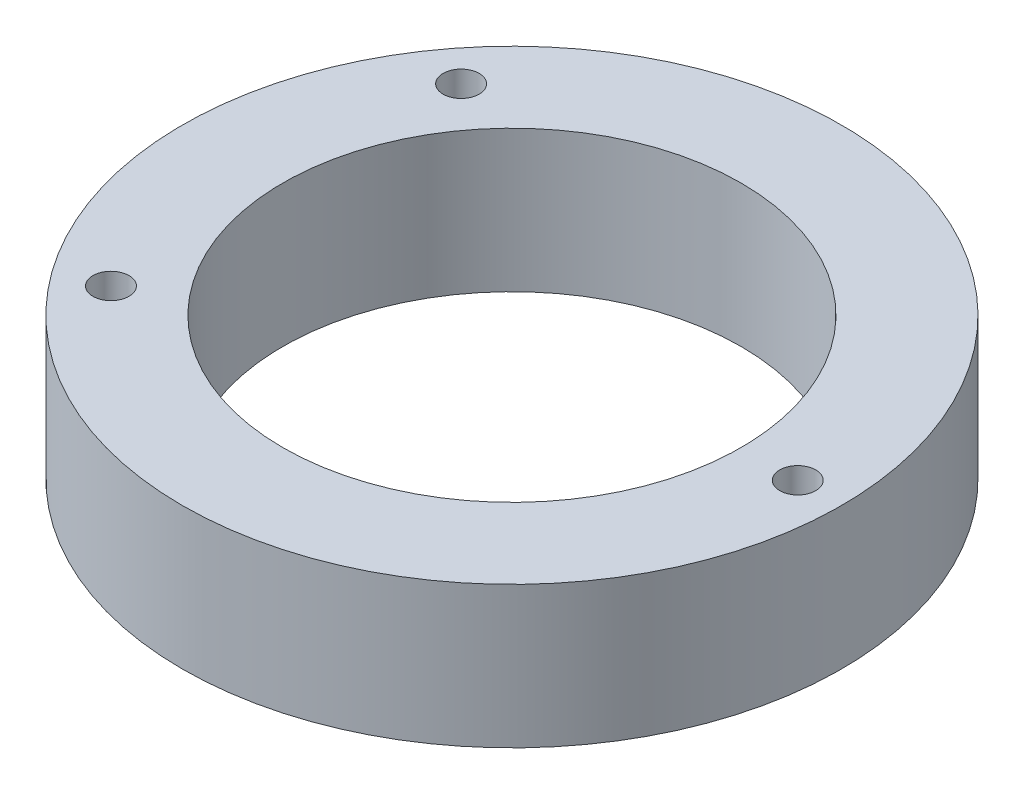
ISO-10303-21;
HEADER;
FILE_DESCRIPTION(('STEP AP214'),'2;1');
FILE_NAME('part.step','',(''),(''),'','','');
FILE_SCHEMA(('AUTOMOTIVE_DESIGN { 1 0 10303 214 1 1 1 1 }'));
ENDSEC;
DATA;
#1=APPLICATION_CONTEXT('core data for automotive mechanical design processes');
#2=APPLICATION_PROTOCOL_DEFINITION('international standard','automotive_design',2000,#1);
#3=PRODUCT_CONTEXT('',#1,'mechanical');
#4=PRODUCT('Part','Part','',(#3));
#5=PRODUCT_RELATED_PRODUCT_CATEGORY('part','',(#4));
#6=PRODUCT_DEFINITION_FORMATION('','',#4);
#7=PRODUCT_DEFINITION_CONTEXT('part definition',#1,'design');
#8=PRODUCT_DEFINITION('design','',#6,#7);
#9=PRODUCT_DEFINITION_SHAPE('','',#8);
#10=(LENGTH_UNIT() NAMED_UNIT(*) SI_UNIT(.MILLI.,.METRE.));
#11=(NAMED_UNIT(*) PLANE_ANGLE_UNIT() SI_UNIT($,.RADIAN.));
#12=(NAMED_UNIT(*) SI_UNIT($,.STERADIAN.) SOLID_ANGLE_UNIT());
#13=UNCERTAINTY_MEASURE_WITH_UNIT(LENGTH_MEASURE(1.E-05),#10,'distance_accuracy_value','');
#14=(GEOMETRIC_REPRESENTATION_CONTEXT(3) GLOBAL_UNCERTAINTY_ASSIGNED_CONTEXT((#13)) GLOBAL_UNIT_ASSIGNED_CONTEXT((#10,
#11,#12)) REPRESENTATION_CONTEXT('',''));
#15=CARTESIAN_POINT('',(0.,0.,0.));
#16=DIRECTION('',(0.,0.,1.));
#17=DIRECTION('',(1.,0.,0.));
#18=AXIS2_PLACEMENT_3D('',#15,#16,#17);
#19=CARTESIAN_POINT('',(0.,13.75,0.));
#20=DIRECTION('',(0.,1.,0.));
#21=DIRECTION('',(0.,0.,1.));
#22=AXIS2_PLACEMENT_3D('',#19,#20,#21);
#23=PLANE('',#22);
#24=CARTESIAN_POINT('',(-21.9327372290304,13.75,17.0005158051838));
#25=DIRECTION('',(0.,1.,0.));
#26=DIRECTION('',(0.,0.,1.));
#27=AXIS2_PLACEMENT_3D('',#24,#25,#26);
#28=CIRCLE('',#27,1.75);
#29=CARTESIAN_POINT('',(-21.9327372290304,13.75,18.7505158051838));
#30=VERTEX_POINT('',#29);
#31=EDGE_CURVE('E52',#30,#30,#28,.T.);
#32=ORIENTED_EDGE('',*,*,#31,.F.);
#33=EDGE_LOOP('',(#32));
#34=FACE_BOUND('',#33,.T.);
#35=CARTESIAN_POINT('',(0.,13.75,0.));
#36=DIRECTION('',(0.,1.,0.));
#37=DIRECTION('',(0.,0.,1.));
#38=AXIS2_PLACEMENT_3D('',#35,#36,#37);
#39=CIRCLE('',#38,22.2499999999997);
#40=CARTESIAN_POINT('',(0.,13.75,22.2499999999997));
#41=VERTEX_POINT('',#40);
#42=EDGE_CURVE('E41',#41,#41,#39,.T.);
#43=ORIENTED_EDGE('',*,*,#42,.F.);
#44=EDGE_LOOP('',(#43));
#45=FACE_BOUND('',#44,.T.);
#46=CARTESIAN_POINT('',(0.,13.75,0.));
#47=DIRECTION('',(0.,1.,0.));
#48=DIRECTION('',(0.,0.,1.));
#49=AXIS2_PLACEMENT_3D('',#46,#47,#48);
#50=CIRCLE('',#49,32.);
#51=CARTESIAN_POINT('',(0.,13.75,32.));
#52=VERTEX_POINT('',#51);
#53=EDGE_CURVE('E10',#52,#52,#50,.T.);
#54=ORIENTED_EDGE('',*,*,#53,.T.);
#55=EDGE_LOOP('',(#54));
#56=FACE_BOUND('',#55,.T.);
#57=CARTESIAN_POINT('',(27.75,13.75,0.));
#58=DIRECTION('',(0.,1.,0.));
#59=DIRECTION('',(0.,0.,1.));
#60=AXIS2_PLACEMENT_3D('',#57,#58,#59);
#61=CIRCLE('',#60,1.75);
#62=CARTESIAN_POINT('',(27.75,13.75,1.75));
#63=VERTEX_POINT('',#62);
#64=EDGE_CURVE('E46',#63,#63,#61,.T.);
#65=ORIENTED_EDGE('',*,*,#64,.F.);
#66=EDGE_LOOP('',(#65));
#67=FACE_BOUND('',#66,.T.);
#68=CARTESIAN_POINT('',(-21.9327372290304,13.75,-17.0005158051838));
#69=DIRECTION('',(0.,1.,0.));
#70=DIRECTION('',(0.,0.,1.));
#71=AXIS2_PLACEMENT_3D('',#68,#69,#70);
#72=CIRCLE('',#71,1.75);
#73=CARTESIAN_POINT('',(-21.9327372290304,13.75,-15.2505158051838));
#74=VERTEX_POINT('',#73);
#75=EDGE_CURVE('E58',#74,#74,#72,.T.);
#76=ORIENTED_EDGE('',*,*,#75,.F.);
#77=EDGE_LOOP('',(#76));
#78=FACE_BOUND('',#77,.T.);
#79=ADVANCED_FACE('F30',(#34,#45,#56,#67,#78),#23,.T.);
#80=CARTESIAN_POINT('',(0.,0.,0.));
#81=DIRECTION('',(0.,1.,0.));
#82=DIRECTION('',(0.,0.,1.));
#83=AXIS2_PLACEMENT_3D('',#80,#81,#82);
#84=PLANE('',#83);
#85=CARTESIAN_POINT('',(0.,0.,0.));
#86=DIRECTION('',(0.,1.,0.));
#87=DIRECTION('',(0.,0.,1.));
#88=AXIS2_PLACEMENT_3D('',#85,#86,#87);
#89=CIRCLE('',#88,32.);
#90=CARTESIAN_POINT('',(0.,0.,32.));
#91=VERTEX_POINT('',#90);
#92=EDGE_CURVE('E34',#91,#91,#89,.T.);
#93=ORIENTED_EDGE('',*,*,#92,.F.);
#94=EDGE_LOOP('',(#93));
#95=FACE_BOUND('',#94,.T.);
#96=CARTESIAN_POINT('',(0.,0.,0.));
#97=DIRECTION('',(0.,1.,0.));
#98=DIRECTION('',(0.,0.,1.));
#99=AXIS2_PLACEMENT_3D('',#96,#97,#98);
#100=CIRCLE('',#99,22.2499999999997);
#101=CARTESIAN_POINT('',(0.,0.,22.2499999999997));
#102=VERTEX_POINT('',#101);
#103=EDGE_CURVE('E43',#102,#102,#100,.T.);
#104=ORIENTED_EDGE('',*,*,#103,.T.);
#105=EDGE_LOOP('',(#104));
#106=FACE_BOUND('',#105,.T.);
#107=CARTESIAN_POINT('',(27.75,0.,0.));
#108=DIRECTION('',(0.,1.,0.));
#109=DIRECTION('',(0.,0.,1.));
#110=AXIS2_PLACEMENT_3D('',#107,#108,#109);
#111=CIRCLE('',#110,1.75);
#112=CARTESIAN_POINT('',(27.75,0.,1.75));
#113=VERTEX_POINT('',#112);
#114=EDGE_CURVE('E49',#113,#113,#111,.T.);
#115=ORIENTED_EDGE('',*,*,#114,.T.);
#116=EDGE_LOOP('',(#115));
#117=FACE_BOUND('',#116,.T.);
#118=CARTESIAN_POINT('',(-21.9327372290304,0.,17.0005158051838));
#119=DIRECTION('',(0.,1.,0.));
#120=DIRECTION('',(0.,0.,1.));
#121=AXIS2_PLACEMENT_3D('',#118,#119,#120);
#122=CIRCLE('',#121,1.75);
#123=CARTESIAN_POINT('',(-21.9327372290304,0.,18.7505158051838));
#124=VERTEX_POINT('',#123);
#125=EDGE_CURVE('E55',#124,#124,#122,.T.);
#126=ORIENTED_EDGE('',*,*,#125,.T.);
#127=EDGE_LOOP('',(#126));
#128=FACE_BOUND('',#127,.T.);
#129=CARTESIAN_POINT('',(-21.9327372290304,0.,-17.0005158051838));
#130=DIRECTION('',(0.,1.,0.));
#131=DIRECTION('',(0.,0.,1.));
#132=AXIS2_PLACEMENT_3D('',#129,#130,#131);
#133=CIRCLE('',#132,1.75);
#134=CARTESIAN_POINT('',(-21.9327372290304,0.,-15.2505158051838));
#135=VERTEX_POINT('',#134);
#136=EDGE_CURVE('E61',#135,#135,#133,.T.);
#137=ORIENTED_EDGE('',*,*,#136,.T.);
#138=EDGE_LOOP('',(#137));
#139=FACE_BOUND('',#138,.T.);
#140=ADVANCED_FACE('F71',(#95,#106,#117,#128,#139),#84,.F.);
#141=CARTESIAN_POINT('',(0.,13.75,0.));
#142=DIRECTION('',(0.,-1.,0.));
#143=DIRECTION('',(0.,0.,-1.));
#144=AXIS2_PLACEMENT_3D('',#141,#142,#143);
#145=CYLINDRICAL_SURFACE('',#144,32.);
#146=ORIENTED_EDGE('',*,*,#53,.F.);
#147=EDGE_LOOP('',(#146));
#148=FACE_BOUND('',#147,.T.);
#149=ORIENTED_EDGE('',*,*,#92,.T.);
#150=EDGE_LOOP('',(#149));
#151=FACE_BOUND('',#150,.T.);
#152=ADVANCED_FACE('F32',(#148,#151),#145,.T.);
#153=CARTESIAN_POINT('',(0.,13.75,0.));
#154=DIRECTION('',(0.,-1.,0.));
#155=DIRECTION('',(0.,0.,-1.));
#156=AXIS2_PLACEMENT_3D('',#153,#154,#155);
#157=CYLINDRICAL_SURFACE('',#156,22.2499999999997);
#158=ORIENTED_EDGE('',*,*,#42,.T.);
#159=EDGE_LOOP('',(#158));
#160=FACE_BOUND('',#159,.T.);
#161=ORIENTED_EDGE('',*,*,#103,.F.);
#162=EDGE_LOOP('',(#161));
#163=FACE_BOUND('',#162,.T.);
#164=ADVANCED_FACE('F81',(#160,#163),#157,.F.);
#165=CARTESIAN_POINT('',(27.75,13.75,0.));
#166=DIRECTION('',(0.,-1.,0.));
#167=DIRECTION('',(0.,0.,-1.));
#168=AXIS2_PLACEMENT_3D('',#165,#166,#167);
#169=CYLINDRICAL_SURFACE('',#168,1.75);
#170=ORIENTED_EDGE('',*,*,#64,.T.);
#171=EDGE_LOOP('',(#170));
#172=FACE_BOUND('',#171,.T.);
#173=ORIENTED_EDGE('',*,*,#114,.F.);
#174=EDGE_LOOP('',(#173));
#175=FACE_BOUND('',#174,.T.);
#176=ADVANCED_FACE('F84',(#172,#175),#169,.F.);
#177=CARTESIAN_POINT('',(-21.9327372290304,13.75,17.0005158051838));
#178=DIRECTION('',(0.,-1.,0.));
#179=DIRECTION('',(0.,0.,-1.));
#180=AXIS2_PLACEMENT_3D('',#177,#178,#179);
#181=CYLINDRICAL_SURFACE('',#180,1.75);
#182=ORIENTED_EDGE('',*,*,#31,.T.);
#183=EDGE_LOOP('',(#182));
#184=FACE_BOUND('',#183,.T.);
#185=ORIENTED_EDGE('',*,*,#125,.F.);
#186=EDGE_LOOP('',(#185));
#187=FACE_BOUND('',#186,.T.);
#188=ADVANCED_FACE('F88',(#184,#187),#181,.F.);
#189=CARTESIAN_POINT('',(-21.9327372290304,13.75,-17.0005158051838));
#190=DIRECTION('',(0.,-1.,0.));
#191=DIRECTION('',(0.,0.,-1.));
#192=AXIS2_PLACEMENT_3D('',#189,#190,#191);
#193=CYLINDRICAL_SURFACE('',#192,1.75);
#194=ORIENTED_EDGE('',*,*,#75,.T.);
#195=EDGE_LOOP('',(#194));
#196=FACE_BOUND('',#195,.T.);
#197=ORIENTED_EDGE('',*,*,#136,.F.);
#198=EDGE_LOOP('',(#197));
#199=FACE_BOUND('',#198,.T.);
#200=ADVANCED_FACE('F67',(#196,#199),#193,.F.);
#201=CLOSED_SHELL('',(#79,#140,#152,#164,#176,#188,#200));
#202=MANIFOLD_SOLID_BREP('B2',#201);
#203=ADVANCED_BREP_SHAPE_REPRESENTATION('',(#18,#202),#14);
#204=SHAPE_DEFINITION_REPRESENTATION(#9,#203);
ENDSEC;
END-ISO-10303-21;
